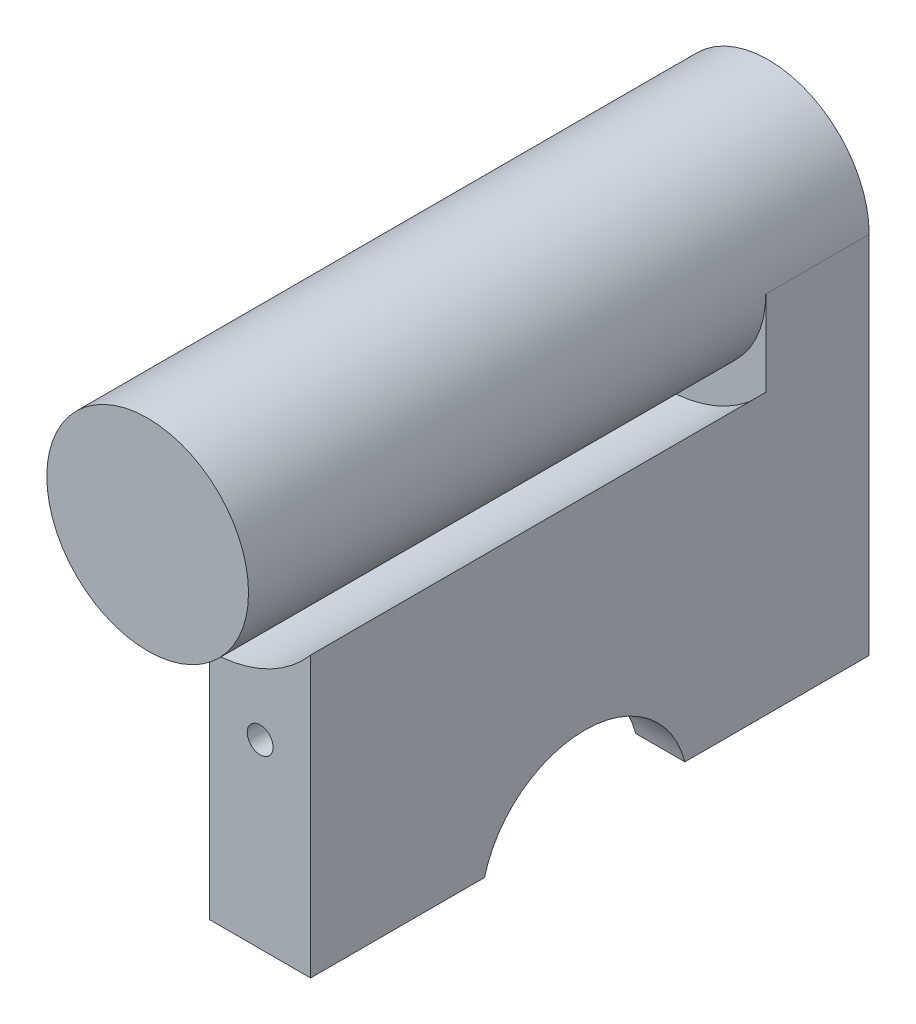
ISO-10303-21;
HEADER;
FILE_DESCRIPTION(('STEP AP214'),'2;1');
FILE_NAME('part.step','',(''),(''),'','','');
FILE_SCHEMA(('AUTOMOTIVE_DESIGN { 1 0 10303 214 1 1 1 1 }'));
ENDSEC;
DATA;
#1=APPLICATION_CONTEXT('core data for automotive mechanical design processes');
#2=APPLICATION_PROTOCOL_DEFINITION('international standard','automotive_design',2000,#1);
#3=PRODUCT_CONTEXT('',#1,'mechanical');
#4=PRODUCT('Part','Part','',(#3));
#5=PRODUCT_RELATED_PRODUCT_CATEGORY('part','',(#4));
#6=PRODUCT_DEFINITION_FORMATION('','',#4);
#7=PRODUCT_DEFINITION_CONTEXT('part definition',#1,'design');
#8=PRODUCT_DEFINITION('design','',#6,#7);
#9=PRODUCT_DEFINITION_SHAPE('','',#8);
#10=(LENGTH_UNIT() NAMED_UNIT(*) SI_UNIT(.MILLI.,.METRE.));
#11=(NAMED_UNIT(*) PLANE_ANGLE_UNIT() SI_UNIT($,.RADIAN.));
#12=(NAMED_UNIT(*) SI_UNIT($,.STERADIAN.) SOLID_ANGLE_UNIT());
#13=UNCERTAINTY_MEASURE_WITH_UNIT(LENGTH_MEASURE(1.E-05),#10,'distance_accuracy_value','');
#14=(GEOMETRIC_REPRESENTATION_CONTEXT(3) GLOBAL_UNCERTAINTY_ASSIGNED_CONTEXT((#13)) GLOBAL_UNIT_ASSIGNED_CONTEXT((#10,
#11,#12)) REPRESENTATION_CONTEXT('',''));
#15=CARTESIAN_POINT('',(0.,0.,0.));
#16=DIRECTION('',(0.,0.,1.));
#17=DIRECTION('',(1.,0.,0.));
#18=AXIS2_PLACEMENT_3D('',#15,#16,#17);
#19=CARTESIAN_POINT('',(17.,-7.55,5.5));
#20=DIRECTION('',(-1.,0.,0.));
#21=DIRECTION('',(0.,0.,1.));
#22=AXIS2_PLACEMENT_3D('',#19,#20,#21);
#23=CYLINDRICAL_SURFACE('',#22,2.);
#24=CARTESIAN_POINT('',(1.,-7.55,5.5));
#25=DIRECTION('',(-1.,0.,0.));
#26=DIRECTION('',(0.,0.,1.));
#27=AXIS2_PLACEMENT_3D('',#24,#25,#26);
#28=CIRCLE('',#27,2.);
#29=CARTESIAN_POINT('',(1.,-7.05,3.56350832689629));
#30=VERTEX_POINT('',#29);
#31=CARTESIAN_POINT('',(1.,-7.05,7.43649167310371));
#32=VERTEX_POINT('',#31);
#33=EDGE_CURVE('E50',#30,#32,#28,.F.);
#34=ORIENTED_EDGE('',*,*,#33,.F.);
#35=DIRECTION('',(-1.,0.,0.));
#36=VECTOR('',#35,1.);
#37=CARTESIAN_POINT('',(17.,-7.05,3.56350832689629));
#38=LINE('',#37,#36);
#39=CARTESIAN_POINT('',(1.95,-7.05,3.56350832689629));
#40=VERTEX_POINT('',#39);
#41=EDGE_CURVE('E187',#40,#30,#38,.T.);
#42=ORIENTED_EDGE('',*,*,#41,.F.);
#43=CARTESIAN_POINT('',(1.95,-7.55,5.5));
#44=DIRECTION('',(1.,0.,0.));
#45=DIRECTION('',(0.,0.,-1.));
#46=AXIS2_PLACEMENT_3D('',#43,#44,#45);
#47=CIRCLE('',#46,2.);
#48=CARTESIAN_POINT('',(1.95,-7.05,7.43649167310371));
#49=VERTEX_POINT('',#48);
#50=EDGE_CURVE('E200',#40,#49,#47,.T.);
#51=ORIENTED_EDGE('',*,*,#50,.T.);
#52=DIRECTION('',(-1.,0.,0.));
#53=VECTOR('',#52,1.);
#54=CARTESIAN_POINT('',(17.,-7.05,7.43649167310371));
#55=LINE('',#54,#53);
#56=EDGE_CURVE('E65',#32,#49,#55,.F.);
#57=ORIENTED_EDGE('',*,*,#56,.F.);
#58=EDGE_LOOP('',(#34,#42,#51,#57));
#59=FACE_BOUND('',#58,.T.);
#60=ADVANCED_FACE('F40',(#59),#23,.F.);
#61=CARTESIAN_POINT('',(1.95,-7.05,2.));
#62=DIRECTION('',(0.,1.,0.));
#63=DIRECTION('',(0.,0.,1.));
#64=AXIS2_PLACEMENT_3D('',#61,#62,#63);
#65=PLANE('',#64);
#66=DIRECTION('',(0.,0.,1.));
#67=VECTOR('',#66,1.);
#68=CARTESIAN_POINT('',(1.,-7.05,2.));
#69=LINE('',#68,#67);
#70=CARTESIAN_POINT('',(1.,-7.05,2.8008500853417));
#71=VERTEX_POINT('',#70);
#72=EDGE_CURVE('E57',#71,#30,#69,.T.);
#73=ORIENTED_EDGE('',*,*,#72,.F.);
#74=DIRECTION('',(-1.,0.,0.));
#75=VECTOR('',#74,1.);
#76=CARTESIAN_POINT('',(1.,-7.05,2.8008500853417));
#77=LINE('',#76,#75);
#78=CARTESIAN_POINT('',(0.,-7.05,2.8008500853417));
#79=VERTEX_POINT('',#78);
#80=EDGE_CURVE('E203',#71,#79,#77,.T.);
#81=ORIENTED_EDGE('',*,*,#80,.T.);
#82=DIRECTION('',(0.,0.,-1.));
#83=VECTOR('',#82,1.);
#84=CARTESIAN_POINT('',(0.,-7.05,2.));
#85=LINE('',#84,#83);
#86=CARTESIAN_POINT('',(0.,-7.05,0.));
#87=VERTEX_POINT('',#86);
#88=EDGE_CURVE('E159',#79,#87,#85,.T.);
#89=ORIENTED_EDGE('',*,*,#88,.T.);
#90=DIRECTION('',(-1.,0.,0.));
#91=VECTOR('',#90,1.);
#92=CARTESIAN_POINT('',(1.95,-7.05,0.));
#93=LINE('',#92,#91);
#94=CARTESIAN_POINT('',(1.95,-7.05,0.));
#95=VERTEX_POINT('',#94);
#96=EDGE_CURVE('E169',#95,#87,#93,.T.);
#97=ORIENTED_EDGE('',*,*,#96,.F.);
#98=DIRECTION('',(0.,0.,-1.));
#99=VECTOR('',#98,1.);
#100=CARTESIAN_POINT('',(1.95,-7.05,2.));
#101=LINE('',#100,#99);
#102=EDGE_CURVE('E149',#40,#95,#101,.T.);
#103=ORIENTED_EDGE('',*,*,#102,.F.);
#104=ORIENTED_EDGE('',*,*,#41,.T.);
#105=EDGE_LOOP('',(#73,#81,#89,#97,#103,#104));
#106=FACE_BOUND('',#105,.T.);
#107=ADVANCED_FACE('F277',(#106),#65,.F.);
#108=CARTESIAN_POINT('',(0.,0.,12.));
#109=DIRECTION('',(0.,0.,-1.));
#110=DIRECTION('',(-1.,0.,0.));
#111=AXIS2_PLACEMENT_3D('',#108,#109,#110);
#112=CYLINDRICAL_SURFACE('',#111,1.95);
#113=CARTESIAN_POINT('',(0.,0.,2.));
#114=DIRECTION('',(0.,0.,-1.));
#115=DIRECTION('',(0.,1.,0.));
#116=AXIS2_PLACEMENT_3D('',#113,#114,#115);
#117=CIRCLE('',#116,1.95);
#118=CARTESIAN_POINT('',(1.95,0.,2.));
#119=VERTEX_POINT('',#118);
#120=CARTESIAN_POINT('',(0.,-1.95,2.));
#121=VERTEX_POINT('',#120);
#122=EDGE_CURVE('E139',#119,#121,#117,.T.);
#123=ORIENTED_EDGE('',*,*,#122,.F.);
#124=DIRECTION('',(0.,0.,1.));
#125=VECTOR('',#124,1.);
#126=CARTESIAN_POINT('',(1.95,0.,0.));
#127=LINE('',#126,#125);
#128=CARTESIAN_POINT('',(1.95,0.,0.));
#129=VERTEX_POINT('',#128);
#130=EDGE_CURVE('E136',#129,#119,#127,.T.);
#131=ORIENTED_EDGE('',*,*,#130,.F.);
#132=CARTESIAN_POINT('',(0.,0.,0.));
#133=DIRECTION('',(0.,0.,1.));
#134=DIRECTION('',(1.,0.,0.));
#135=AXIS2_PLACEMENT_3D('',#132,#133,#134);
#136=CIRCLE('',#135,1.95);
#137=CARTESIAN_POINT('',(0.,-1.95,0.));
#138=VERTEX_POINT('',#137);
#139=EDGE_CURVE('E121',#129,#138,#136,.T.);
#140=ORIENTED_EDGE('',*,*,#139,.T.);
#141=DIRECTION('',(0.,0.,-1.));
#142=VECTOR('',#141,1.);
#143=CARTESIAN_POINT('',(0.,-1.95,12.));
#144=LINE('',#143,#142);
#145=EDGE_CURVE('E133',#121,#138,#144,.T.);
#146=ORIENTED_EDGE('',*,*,#145,.F.);
#147=EDGE_LOOP('',(#123,#131,#140,#146));
#148=FACE_BOUND('',#147,.T.);
#149=CARTESIAN_POINT('',(0.,0.,12.));
#150=DIRECTION('',(0.,0.,1.));
#151=DIRECTION('',(1.,0.,0.));
#152=AXIS2_PLACEMENT_3D('',#149,#150,#151);
#153=CIRCLE('',#152,1.95);
#154=CARTESIAN_POINT('',(1.95,0.,12.));
#155=VERTEX_POINT('',#154);
#156=EDGE_CURVE('E132',#155,#155,#153,.T.);
#157=ORIENTED_EDGE('',*,*,#156,.F.);
#158=EDGE_LOOP('',(#157));
#159=FACE_BOUND('',#158,.T.);
#160=ADVANCED_FACE('F42',(#148,#159),#112,.T.);
#161=CARTESIAN_POINT('',(0.,0.,12.));
#162=DIRECTION('',(0.,0.,1.));
#163=DIRECTION('',(1.,0.,0.));
#164=AXIS2_PLACEMENT_3D('',#161,#162,#163);
#165=PLANE('',#164);
#166=ORIENTED_EDGE('',*,*,#156,.T.);
#167=EDGE_LOOP('',(#166));
#168=FACE_BOUND('',#167,.T.);
#169=ADVANCED_FACE('F338',(#168),#165,.T.);
#170=CARTESIAN_POINT('',(0.,0.,0.));
#171=DIRECTION('',(0.,0.,1.));
#172=DIRECTION('',(1.,0.,0.));
#173=AXIS2_PLACEMENT_3D('',#170,#171,#172);
#174=PLANE('',#173);
#175=CARTESIAN_POINT('',(0.975,-3.55,0.));
#176=DIRECTION('',(0.,0.,-1.));
#177=DIRECTION('',(-1.,0.,0.));
#178=AXIS2_PLACEMENT_3D('',#175,#176,#177);
#179=CIRCLE('',#178,0.25);
#180=CARTESIAN_POINT('',(0.725,-3.55,0.));
#181=VERTEX_POINT('',#180);
#182=EDGE_CURVE('E252',#181,#181,#179,.T.);
#183=ORIENTED_EDGE('',*,*,#182,.F.);
#184=EDGE_LOOP('',(#183));
#185=FACE_BOUND('',#184,.T.);
#186=ORIENTED_EDGE('',*,*,#139,.F.);
#187=DIRECTION('',(0.,1.,0.));
#188=VECTOR('',#187,1.);
#189=CARTESIAN_POINT('',(1.95,1.95,0.));
#190=LINE('',#189,#188);
#191=EDGE_CURVE('E126',#95,#129,#190,.T.);
#192=ORIENTED_EDGE('',*,*,#191,.F.);
#193=ORIENTED_EDGE('',*,*,#96,.T.);
#194=DIRECTION('',(0.,1.,0.));
#195=VECTOR('',#194,1.);
#196=CARTESIAN_POINT('',(0.,1.95,0.));
#197=LINE('',#196,#195);
#198=EDGE_CURVE('E128',#87,#138,#197,.T.);
#199=ORIENTED_EDGE('',*,*,#198,.T.);
#200=EDGE_LOOP('',(#186,#192,#193,#199));
#201=FACE_BOUND('',#200,.T.);
#202=ADVANCED_FACE('F123',(#185,#201),#174,.F.);
#203=CARTESIAN_POINT('',(1.95,0.,0.));
#204=DIRECTION('',(1.,0.,0.));
#205=DIRECTION('',(0.,0.,-1.));
#206=AXIS2_PLACEMENT_3D('',#203,#204,#205);
#207=PLANE('',#206);
#208=ORIENTED_EDGE('',*,*,#130,.T.);
#209=DIRECTION('',(0.,-1.,0.));
#210=VECTOR('',#209,1.);
#211=CARTESIAN_POINT('',(1.95,1.95,2.));
#212=LINE('',#211,#210);
#213=CARTESIAN_POINT('',(1.95,-1.6431676725155,2.));
#214=VERTEX_POINT('',#213);
#215=EDGE_CURVE('E152',#119,#214,#212,.T.);
#216=ORIENTED_EDGE('',*,*,#215,.T.);
#217=DIRECTION('',(0.,0.,-1.));
#218=VECTOR('',#217,1.);
#219=CARTESIAN_POINT('',(1.95,-1.6431676725155,10.8));
#220=LINE('',#219,#218);
#221=CARTESIAN_POINT('',(1.95,-1.6431676725155,10.8));
#222=VERTEX_POINT('',#221);
#223=EDGE_CURVE('E221',#222,#214,#220,.T.);
#224=ORIENTED_EDGE('',*,*,#223,.F.);
#225=DIRECTION('',(0.,1.,0.));
#226=VECTOR('',#225,1.);
#227=CARTESIAN_POINT('',(1.95,0.,10.8));
#228=LINE('',#227,#226);
#229=CARTESIAN_POINT('',(1.95,-7.05,10.8));
#230=VERTEX_POINT('',#229);
#231=EDGE_CURVE('E207',#230,#222,#228,.T.);
#232=ORIENTED_EDGE('',*,*,#231,.F.);
#233=EDGE_CURVE('E165',#230,#49,#101,.T.);
#234=ORIENTED_EDGE('',*,*,#233,.T.);
#235=ORIENTED_EDGE('',*,*,#50,.F.);
#236=ORIENTED_EDGE('',*,*,#102,.T.);
#237=ORIENTED_EDGE('',*,*,#191,.T.);
#238=EDGE_LOOP('',(#208,#216,#224,#232,#234,#235,#236,#237));
#239=FACE_BOUND('',#238,.T.);
#240=ADVANCED_FACE('F146',(#239),#207,.T.);
#241=CARTESIAN_POINT('',(0.,0.,0.));
#242=DIRECTION('',(1.,0.,0.));
#243=DIRECTION('',(0.,0.,-1.));
#244=AXIS2_PLACEMENT_3D('',#241,#242,#243);
#245=PLANE('',#244);
#246=ORIENTED_EDGE('',*,*,#88,.F.);
#247=CARTESIAN_POINT('',(0.,-7.55,5.50501354193969));
#248=DIRECTION('',(-1.,0.,0.));
#249=DIRECTION('',(0.,0.,1.));
#250=AXIS2_PLACEMENT_3D('',#247,#248,#249);
#251=CIRCLE('',#250,2.75);
#252=CARTESIAN_POINT('',(0.,-7.05,8.20917699853768));
#253=VERTEX_POINT('',#252);
#254=EDGE_CURVE('E144',#253,#79,#251,.T.);
#255=ORIENTED_EDGE('',*,*,#254,.F.);
#256=CARTESIAN_POINT('',(0.,-7.05,10.8));
#257=VERTEX_POINT('',#256);
#258=EDGE_CURVE('E153',#257,#253,#85,.T.);
#259=ORIENTED_EDGE('',*,*,#258,.F.);
#260=DIRECTION('',(0.,-1.,0.));
#261=VECTOR('',#260,1.);
#262=CARTESIAN_POINT('',(0.,0.,10.8));
#263=LINE('',#262,#261);
#264=CARTESIAN_POINT('',(0.,-2.55,10.8));
#265=VERTEX_POINT('',#264);
#266=EDGE_CURVE('E216',#265,#257,#263,.T.);
#267=ORIENTED_EDGE('',*,*,#266,.F.);
#268=DIRECTION('',(0.,0.,-1.));
#269=VECTOR('',#268,1.);
#270=CARTESIAN_POINT('',(0.,-2.55,10.8));
#271=LINE('',#270,#269);
#272=CARTESIAN_POINT('',(0.,-2.55,2.));
#273=VERTEX_POINT('',#272);
#274=EDGE_CURVE('E162',#265,#273,#271,.T.);
#275=ORIENTED_EDGE('',*,*,#274,.T.);
#276=DIRECTION('',(0.,-1.,0.));
#277=VECTOR('',#276,1.);
#278=CARTESIAN_POINT('',(0.,1.95,2.));
#279=LINE('',#278,#277);
#280=EDGE_CURVE('E172',#121,#273,#279,.T.);
#281=ORIENTED_EDGE('',*,*,#280,.F.);
#282=ORIENTED_EDGE('',*,*,#145,.T.);
#283=ORIENTED_EDGE('',*,*,#198,.F.);
#284=EDGE_LOOP('',(#246,#255,#259,#267,#275,#281,#282,#283));
#285=FACE_BOUND('',#284,.T.);
#286=ADVANCED_FACE('F237',(#285),#245,.F.);
#287=CARTESIAN_POINT('',(1.95,1.95,2.));
#288=DIRECTION('',(0.,0.,-1.));
#289=DIRECTION('',(0.,1.,0.));
#290=AXIS2_PLACEMENT_3D('',#287,#288,#289);
#291=PLANE('',#290);
#292=ORIENTED_EDGE('',*,*,#280,.T.);
#293=CARTESIAN_POINT('',(0.,0.,2.));
#294=DIRECTION('',(0.,0.,1.));
#295=DIRECTION('',(1.,0.,0.));
#296=AXIS2_PLACEMENT_3D('',#293,#294,#295);
#297=CIRCLE('',#296,2.55);
#298=EDGE_CURVE('E202',#273,#214,#297,.T.);
#299=ORIENTED_EDGE('',*,*,#298,.T.);
#300=ORIENTED_EDGE('',*,*,#215,.F.);
#301=ORIENTED_EDGE('',*,*,#122,.T.);
#302=EDGE_LOOP('',(#292,#299,#300,#301));
#303=FACE_BOUND('',#302,.T.);
#304=ADVANCED_FACE('F240',(#303),#291,.F.);
#305=ORIENTED_EDGE('',*,*,#258,.T.);
#306=DIRECTION('',(-1.,0.,0.));
#307=VECTOR('',#306,1.);
#308=CARTESIAN_POINT('',(1.,-7.05,8.20917699853768));
#309=LINE('',#308,#307);
#310=CARTESIAN_POINT('',(1.,-7.05,8.20917699853768));
#311=VERTEX_POINT('',#310);
#312=EDGE_CURVE('E11',#253,#311,#309,.F.);
#313=ORIENTED_EDGE('',*,*,#312,.T.);
#314=DIRECTION('',(0.,0.,1.));
#315=VECTOR('',#314,1.);
#316=CARTESIAN_POINT('',(1.,-7.05,2.));
#317=LINE('',#316,#315);
#318=EDGE_CURVE('E193',#32,#311,#317,.T.);
#319=ORIENTED_EDGE('',*,*,#318,.F.);
#320=ORIENTED_EDGE('',*,*,#56,.T.);
#321=ORIENTED_EDGE('',*,*,#233,.F.);
#322=DIRECTION('',(1.,0.,0.));
#323=VECTOR('',#322,1.);
#324=CARTESIAN_POINT('',(0.,-7.05,10.8));
#325=LINE('',#324,#323);
#326=EDGE_CURVE('E210',#257,#230,#325,.T.);
#327=ORIENTED_EDGE('',*,*,#326,.F.);
#328=EDGE_LOOP('',(#305,#313,#319,#320,#321,#327));
#329=FACE_BOUND('',#328,.T.);
#330=ADVANCED_FACE('F196',(#329),#65,.F.);
#331=CARTESIAN_POINT('',(0.,0.,10.8));
#332=DIRECTION('',(0.,0.,-1.));
#333=DIRECTION('',(-1.,0.,0.));
#334=AXIS2_PLACEMENT_3D('',#331,#332,#333);
#335=CYLINDRICAL_SURFACE('',#334,2.55);
#336=ORIENTED_EDGE('',*,*,#298,.F.);
#337=ORIENTED_EDGE('',*,*,#274,.F.);
#338=CARTESIAN_POINT('',(0.,0.,10.8));
#339=DIRECTION('',(0.,0.,1.));
#340=DIRECTION('',(1.,0.,0.));
#341=AXIS2_PLACEMENT_3D('',#338,#339,#340);
#342=CIRCLE('',#341,2.55);
#343=EDGE_CURVE('E223',#265,#222,#342,.T.);
#344=ORIENTED_EDGE('',*,*,#343,.T.);
#345=ORIENTED_EDGE('',*,*,#223,.T.);
#346=EDGE_LOOP('',(#336,#337,#344,#345));
#347=FACE_BOUND('',#346,.T.);
#348=ADVANCED_FACE('F238',(#347),#335,.F.);
#349=CARTESIAN_POINT('',(0.,0.,10.8));
#350=DIRECTION('',(0.,0.,1.));
#351=DIRECTION('',(1.,0.,0.));
#352=AXIS2_PLACEMENT_3D('',#349,#350,#351);
#353=PLANE('',#352);
#354=CARTESIAN_POINT('',(0.975,-3.55,10.8));
#355=DIRECTION('',(0.,0.,1.));
#356=DIRECTION('',(1.,0.,0.));
#357=AXIS2_PLACEMENT_3D('',#354,#355,#356);
#358=CIRCLE('',#357,0.25);
#359=CARTESIAN_POINT('',(1.225,-3.55,10.8));
#360=VERTEX_POINT('',#359);
#361=EDGE_CURVE('E44',#360,#360,#358,.T.);
#362=ORIENTED_EDGE('',*,*,#361,.F.);
#363=EDGE_LOOP('',(#362));
#364=FACE_BOUND('',#363,.T.);
#365=ORIENTED_EDGE('',*,*,#343,.F.);
#366=ORIENTED_EDGE('',*,*,#266,.T.);
#367=ORIENTED_EDGE('',*,*,#326,.T.);
#368=ORIENTED_EDGE('',*,*,#231,.T.);
#369=EDGE_LOOP('',(#365,#366,#367,#368));
#370=FACE_BOUND('',#369,.T.);
#371=ADVANCED_FACE('F214',(#364,#370),#353,.T.);
#372=CARTESIAN_POINT('',(1.,-7.55,5.50501354193969));
#373=DIRECTION('',(-1.,0.,0.));
#374=DIRECTION('',(0.,0.,1.));
#375=AXIS2_PLACEMENT_3D('',#372,#373,#374);
#376=CYLINDRICAL_SURFACE('',#375,2.75);
#377=CARTESIAN_POINT('',(1.,-7.55,5.50501354193969));
#378=DIRECTION('',(-1.,0.,0.));
#379=DIRECTION('',(0.,0.,1.));
#380=AXIS2_PLACEMENT_3D('',#377,#378,#379);
#381=CIRCLE('',#380,2.75);
#382=EDGE_CURVE('E198',#311,#71,#381,.T.);
#383=ORIENTED_EDGE('',*,*,#382,.F.);
#384=ORIENTED_EDGE('',*,*,#312,.F.);
#385=ORIENTED_EDGE('',*,*,#254,.T.);
#386=ORIENTED_EDGE('',*,*,#80,.F.);
#387=EDGE_LOOP('',(#383,#384,#385,#386));
#388=FACE_BOUND('',#387,.T.);
#389=ADVANCED_FACE('F264',(#388),#376,.F.);
#390=CARTESIAN_POINT('',(1.,-7.55,5.50501354193969));
#391=DIRECTION('',(-1.,0.,0.));
#392=DIRECTION('',(0.,0.,1.));
#393=AXIS2_PLACEMENT_3D('',#390,#391,#392);
#394=PLANE('',#393);
#395=ORIENTED_EDGE('',*,*,#72,.T.);
#396=ORIENTED_EDGE('',*,*,#33,.T.);
#397=ORIENTED_EDGE('',*,*,#318,.T.);
#398=ORIENTED_EDGE('',*,*,#382,.T.);
#399=EDGE_LOOP('',(#395,#396,#397,#398));
#400=FACE_BOUND('',#399,.T.);
#401=ADVANCED_FACE('F192',(#400),#394,.T.);
#402=CARTESIAN_POINT('',(0.975,-3.55,12.));
#403=DIRECTION('',(0.,0.,-1.));
#404=DIRECTION('',(-1.,0.,0.));
#405=AXIS2_PLACEMENT_3D('',#402,#403,#404);
#406=CYLINDRICAL_SURFACE('',#405,0.25);
#407=ORIENTED_EDGE('',*,*,#361,.T.);
#408=EDGE_LOOP('',(#407));
#409=FACE_BOUND('',#408,.T.);
#410=ORIENTED_EDGE('',*,*,#182,.T.);
#411=EDGE_LOOP('',(#410));
#412=FACE_BOUND('',#411,.T.);
#413=ADVANCED_FACE('F261',(#409,#412),#406,.F.);
#414=CLOSED_SHELL('',(#60,#107,#160,#169,#202,#240,#286,#304,#330,#348,#371,#389,#401,#413));
#415=MANIFOLD_SOLID_BREP('B2',#414);
#416=ADVANCED_BREP_SHAPE_REPRESENTATION('',(#18,#415),#14);
#417=SHAPE_DEFINITION_REPRESENTATION(#9,#416);
ENDSEC;
END-ISO-10303-21;
